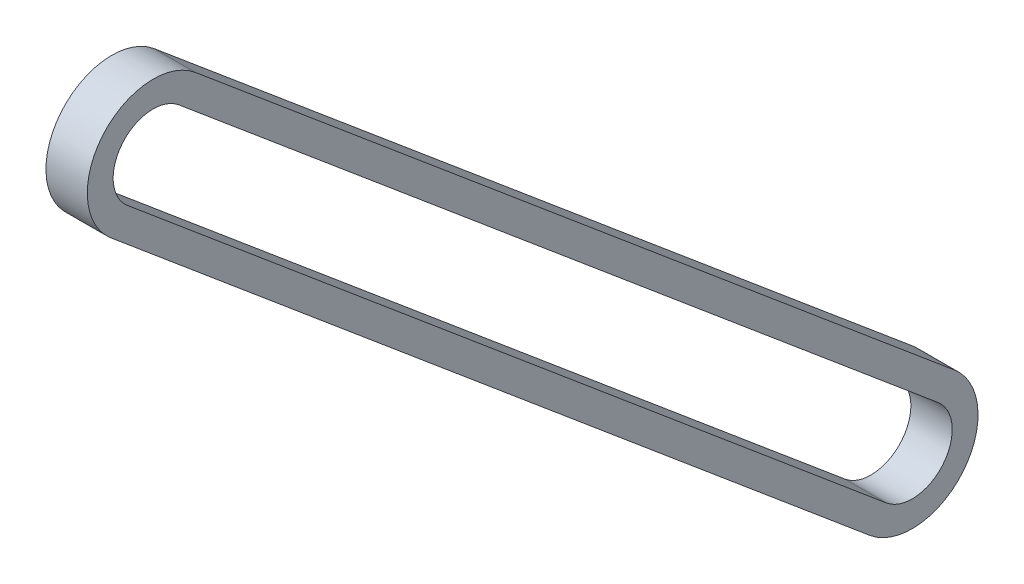
ISO-10303-21;
HEADER;
FILE_DESCRIPTION(('STEP AP214'),'2;1');
FILE_NAME('part.step','',(''),(''),'','','');
FILE_SCHEMA(('AUTOMOTIVE_DESIGN { 1 0 10303 214 1 1 1 1 }'));
ENDSEC;
DATA;
#1=APPLICATION_CONTEXT('core data for automotive mechanical design processes');
#2=APPLICATION_PROTOCOL_DEFINITION('international standard','automotive_design',2000,#1);
#3=PRODUCT_CONTEXT('',#1,'mechanical');
#4=PRODUCT('Part','Part','',(#3));
#5=PRODUCT_RELATED_PRODUCT_CATEGORY('part','',(#4));
#6=PRODUCT_DEFINITION_FORMATION('','',#4);
#7=PRODUCT_DEFINITION_CONTEXT('part definition',#1,'design');
#8=PRODUCT_DEFINITION('design','',#6,#7);
#9=PRODUCT_DEFINITION_SHAPE('','',#8);
#10=(LENGTH_UNIT() NAMED_UNIT(*) SI_UNIT(.MILLI.,.METRE.));
#11=(NAMED_UNIT(*) PLANE_ANGLE_UNIT() SI_UNIT($,.RADIAN.));
#12=(NAMED_UNIT(*) SI_UNIT($,.STERADIAN.) SOLID_ANGLE_UNIT());
#13=UNCERTAINTY_MEASURE_WITH_UNIT(LENGTH_MEASURE(1.E-05),#10,'distance_accuracy_value','');
#14=(GEOMETRIC_REPRESENTATION_CONTEXT(3) GLOBAL_UNCERTAINTY_ASSIGNED_CONTEXT((#13)) GLOBAL_UNIT_ASSIGNED_CONTEXT((#10,
#11,#12)) REPRESENTATION_CONTEXT('',''));
#15=CARTESIAN_POINT('',(0.,0.,0.));
#16=DIRECTION('',(0.,0.,1.));
#17=DIRECTION('',(1.,0.,0.));
#18=AXIS2_PLACEMENT_3D('',#15,#16,#17);
#19=CARTESIAN_POINT('',(3.58823967015649,-11.2727676890632,9.46346433075354));
#20=DIRECTION('',(8.28983744360699E-13,0.765894239141476,-0.642966573353467));
#21=DIRECTION('',(0.,0.642966573353467,0.765894239141476));
#22=AXIS2_PLACEMENT_3D('',#19,#20,#21);
#23=PLANE('',#22);
#24=DIRECTION('',(4.66761576994982E-13,0.642966573353467,0.765894239141476));
#25=VECTOR('',#24,1.);
#26=CARTESIAN_POINT('',(5.18823967015649,-11.2727676890647,9.46346433075382));
#27=LINE('',#26,#25);
#28=CARTESIAN_POINT('',(5.18823967013915,-35.1470704539788,-18.9753250386508));
#29=VERTEX_POINT('',#28);
#30=CARTESIAN_POINT('',(5.18823967015707,-10.4744035818647,10.414466289149));
#31=VERTEX_POINT('',#30);
#32=EDGE_CURVE('E146',#29,#31,#27,.T.);
#33=ORIENTED_EDGE('',*,*,#32,.T.);
#34=DIRECTION('',(1.,-9.3502330184165E-13,1.75522007977071E-13));
#35=VECTOR('',#34,1.);
#36=CARTESIAN_POINT('',(3.58823967015707,-10.4744035818633,10.4144662891487));
#37=LINE('',#36,#35);
#38=CARTESIAN_POINT('',(3.58823967015707,-10.4744035818633,10.4144662891487));
#39=VERTEX_POINT('',#38);
#40=EDGE_CURVE('E11',#39,#31,#37,.T.);
#41=ORIENTED_EDGE('',*,*,#40,.F.);
#42=DIRECTION('',(4.66761576994982E-13,0.642966573353467,0.765894239141476));
#43=VECTOR('',#42,1.);
#44=CARTESIAN_POINT('',(3.58823967015649,-11.2727676890632,9.46346433075354));
#45=LINE('',#44,#43);
#46=CARTESIAN_POINT('',(3.58823967013915,-35.1470704539773,-18.9753250386511));
#47=VERTEX_POINT('',#46);
#48=EDGE_CURVE('E122',#47,#39,#45,.T.);
#49=ORIENTED_EDGE('',*,*,#48,.F.);
#50=DIRECTION('',(1.,-9.3502330184165E-13,1.75522007977071E-13));
#51=VECTOR('',#50,1.);
#52=CARTESIAN_POINT('',(3.58823967013915,-35.1470704539773,-18.9753250386511));
#53=LINE('',#52,#51);
#54=EDGE_CURVE('E153',#47,#29,#53,.T.);
#55=ORIENTED_EDGE('',*,*,#54,.T.);
#56=EDGE_LOOP('',(#33,#41,#49,#55));
#57=FACE_BOUND('',#56,.T.);
#58=ADVANCED_FACE('F41',(#57),#23,.F.);
#59=CARTESIAN_POINT('',(3.58823967015918,-8.52137327205248,8.77490152709738));
#60=DIRECTION('',(1.,-9.3502330184165E-13,1.75522007977071E-13));
#61=DIRECTION('',(9.3502330184165E-13,1.,0.));
#62=AXIS2_PLACEMENT_3D('',#59,#60,#61);
#63=CYLINDRICAL_SURFACE('',#62,2.55000000000001);
#64=CARTESIAN_POINT('',(5.18823967015918,-8.52137327205398,8.77490152709766));
#65=DIRECTION('',(-1.,9.35018043853885E-13,-1.75512184079218E-13));
#66=DIRECTION('',(-9.35018043853885E-13,-1.,0.));
#67=AXIS2_PLACEMENT_3D('',#64,#65,#66);
#68=CIRCLE('',#67,2.55000000000001);
#69=CARTESIAN_POINT('',(5.18823967016129,-6.56834296224321,7.13533676504631));
#70=VERTEX_POINT('',#69);
#71=EDGE_CURVE('E127',#31,#70,#68,.T.);
#72=ORIENTED_EDGE('',*,*,#71,.T.);
#73=DIRECTION('',(1.,-9.3502330184165E-13,1.75522007977071E-13));
#74=VECTOR('',#73,1.);
#75=CARTESIAN_POINT('',(3.58823967016129,-6.56834296224171,7.13533676504603));
#76=LINE('',#75,#74);
#77=CARTESIAN_POINT('',(3.58823967016129,-6.56834296224171,7.13533676504603));
#78=VERTEX_POINT('',#77);
#79=EDGE_CURVE('E51',#78,#70,#76,.T.);
#80=ORIENTED_EDGE('',*,*,#79,.F.);
#81=CARTESIAN_POINT('',(3.58823967015918,-8.52137327205248,8.77490152709738));
#82=DIRECTION('',(-1.,9.35018043853885E-13,-1.75512184079218E-13));
#83=DIRECTION('',(-9.35018043853885E-13,-1.,0.));
#84=AXIS2_PLACEMENT_3D('',#81,#82,#83);
#85=CIRCLE('',#84,2.55000000000001);
#86=EDGE_CURVE('E116',#39,#78,#85,.T.);
#87=ORIENTED_EDGE('',*,*,#86,.F.);
#88=ORIENTED_EDGE('',*,*,#40,.T.);
#89=EDGE_LOOP('',(#72,#80,#87,#88));
#90=FACE_BOUND('',#89,.T.);
#91=ADVANCED_FACE('F126',(#90),#63,.T.);
#92=CARTESIAN_POINT('',(3.58823967016071,-7.36670706944168,6.18433480665086));
#93=DIRECTION('',(-8.28983744360698E-13,-0.765894239141476,0.642966573353467));
#94=DIRECTION('',(0.,-0.642966573353467,-0.765894239141476));
#95=AXIS2_PLACEMENT_3D('',#92,#93,#94);
#96=PLANE('',#95);
#97=DIRECTION('',(-4.66761576994983E-13,-0.642966573353467,-0.765894239141476));
#98=VECTOR('',#97,1.);
#99=CARTESIAN_POINT('',(5.18823967016071,-7.36670706944318,6.18433480665114));
#100=LINE('',#99,#98);
#101=CARTESIAN_POINT('',(5.18823967014338,-31.2410098343573,-22.2544545627535));
#102=VERTEX_POINT('',#101);
#103=EDGE_CURVE('E89',#70,#102,#100,.T.);
#104=ORIENTED_EDGE('',*,*,#103,.T.);
#105=DIRECTION('',(1.,-9.3502330184165E-13,1.75522007977071E-13));
#106=VECTOR('',#105,1.);
#107=CARTESIAN_POINT('',(3.58823967014338,-31.2410098343558,-22.2544545627538));
#108=LINE('',#107,#106);
#109=CARTESIAN_POINT('',(3.58823967014338,-31.2410098343558,-22.2544545627538));
#110=VERTEX_POINT('',#109);
#111=EDGE_CURVE('E128',#110,#102,#108,.T.);
#112=ORIENTED_EDGE('',*,*,#111,.F.);
#113=DIRECTION('',(-4.66761576994983E-13,-0.642966573353467,-0.765894239141476));
#114=VECTOR('',#113,1.);
#115=CARTESIAN_POINT('',(3.58823967016071,-7.36670706944168,6.18433480665086));
#116=LINE('',#115,#114);
#117=EDGE_CURVE('E120',#78,#110,#116,.T.);
#118=ORIENTED_EDGE('',*,*,#117,.F.);
#119=ORIENTED_EDGE('',*,*,#79,.T.);
#120=EDGE_LOOP('',(#104,#112,#118,#119));
#121=FACE_BOUND('',#120,.T.);
#122=ADVANCED_FACE('F130',(#121),#96,.F.);
#123=CARTESIAN_POINT('',(3.58823967014127,-33.1940401441665,-20.6148898007025));
#124=DIRECTION('',(1.,-9.3502330184165E-13,1.75522007977071E-13));
#125=DIRECTION('',(9.3502330184165E-13,1.,0.));
#126=AXIS2_PLACEMENT_3D('',#123,#124,#125);
#127=CYLINDRICAL_SURFACE('',#126,1.55000000000567);
#128=CARTESIAN_POINT('',(5.18823967014127,-33.194040144168,-20.6148898007022));
#129=DIRECTION('',(-1.,9.35018043853885E-13,-1.75512184079218E-13));
#130=DIRECTION('',(-9.35018043853885E-13,-1.,0.));
#131=AXIS2_PLACEMENT_3D('',#128,#129,#130);
#132=CIRCLE('',#131,1.55000000000567);
#133=CARTESIAN_POINT('',(5.18823967014255,-32.0069040734988,-21.6114879894001));
#134=VERTEX_POINT('',#133);
#135=CARTESIAN_POINT('',(5.18823967013998,-34.3811762148373,-19.6182916120043));
#136=VERTEX_POINT('',#135);
#137=EDGE_CURVE('E136',#134,#136,#132,.T.);
#138=ORIENTED_EDGE('',*,*,#137,.F.);
#139=DIRECTION('',(1.,-9.3502330184165E-13,1.75522007977071E-13));
#140=VECTOR('',#139,1.);
#141=CARTESIAN_POINT('',(3.58823967014255,-32.0069040734973,-21.6114879894003));
#142=LINE('',#141,#140);
#143=CARTESIAN_POINT('',(3.58823967014255,-32.0069040734973,-21.6114879894003));
#144=VERTEX_POINT('',#143);
#145=EDGE_CURVE('E45',#144,#134,#142,.T.);
#146=ORIENTED_EDGE('',*,*,#145,.F.);
#147=CARTESIAN_POINT('',(3.58823967014127,-33.1940401441665,-20.6148898007025));
#148=DIRECTION('',(-1.,9.35018043853885E-13,-1.75512184079218E-13));
#149=DIRECTION('',(-9.35018043853885E-13,-1.,0.));
#150=AXIS2_PLACEMENT_3D('',#147,#148,#149);
#151=CIRCLE('',#150,1.55000000000567);
#152=CARTESIAN_POINT('',(3.58823967013998,-34.3811762148358,-19.6182916120046));
#153=VERTEX_POINT('',#152);
#154=EDGE_CURVE('E152',#144,#153,#151,.T.);
#155=ORIENTED_EDGE('',*,*,#154,.T.);
#156=DIRECTION('',(1.,-9.3502330184165E-13,1.75522007977071E-13));
#157=VECTOR('',#156,1.);
#158=CARTESIAN_POINT('',(3.58823967013998,-34.3811762148358,-19.6182916120046));
#159=LINE('',#158,#157);
#160=EDGE_CURVE('E132',#153,#136,#159,.T.);
#161=ORIENTED_EDGE('',*,*,#160,.T.);
#162=EDGE_LOOP('',(#138,#146,#155,#161));
#163=FACE_BOUND('',#162,.T.);
#164=ADVANCED_FACE('F43',(#163),#127,.F.);
#165=CARTESIAN_POINT('',(3.58823967015989,-8.13260130858316,6.82730138000433));
#166=DIRECTION('',(8.28983744360698E-13,0.765894239141476,-0.642966573353467));
#167=DIRECTION('',(0.,0.642966573353467,0.765894239141476));
#168=AXIS2_PLACEMENT_3D('',#165,#166,#167);
#169=PLANE('',#168);
#170=DIRECTION('',(4.66761576994983E-13,0.642966573353467,0.765894239141476));
#171=VECTOR('',#170,1.);
#172=CARTESIAN_POINT('',(5.18823967015989,-8.13260130858466,6.82730138000461));
#173=LINE('',#172,#171);
#174=CARTESIAN_POINT('',(5.18823967016046,-7.33423720138469,7.77830333839978));
#175=VERTEX_POINT('',#174);
#176=EDGE_CURVE('E139',#134,#175,#173,.T.);
#177=ORIENTED_EDGE('',*,*,#176,.T.);
#178=DIRECTION('',(1.,-9.3502330184165E-13,1.75522007977071E-13));
#179=VECTOR('',#178,1.);
#180=CARTESIAN_POINT('',(3.58823967016046,-7.33423720138319,7.7783033383995));
#181=LINE('',#180,#179);
#182=CARTESIAN_POINT('',(3.58823967016046,-7.33423720138319,7.7783033383995));
#183=VERTEX_POINT('',#182);
#184=EDGE_CURVE('E159',#183,#175,#181,.T.);
#185=ORIENTED_EDGE('',*,*,#184,.F.);
#186=DIRECTION('',(4.66761576994983E-13,0.642966573353467,0.765894239141476));
#187=VECTOR('',#186,1.);
#188=CARTESIAN_POINT('',(3.58823967015989,-8.13260130858316,6.82730138000433));
#189=LINE('',#188,#187);
#190=EDGE_CURVE('E168',#144,#183,#189,.T.);
#191=ORIENTED_EDGE('',*,*,#190,.F.);
#192=ORIENTED_EDGE('',*,*,#145,.T.);
#193=EDGE_LOOP('',(#177,#185,#191,#192));
#194=FACE_BOUND('',#193,.T.);
#195=ADVANCED_FACE('F167',(#194),#169,.F.);
#196=CARTESIAN_POINT('',(3.58823967015918,-8.52137327205248,8.77490152709738));
#197=DIRECTION('',(1.,-9.3502330184165E-13,1.75522007977071E-13));
#198=DIRECTION('',(9.3502330184165E-13,1.,0.));
#199=AXIS2_PLACEMENT_3D('',#196,#197,#198);
#200=CYLINDRICAL_SURFACE('',#199,1.55);
#201=CARTESIAN_POINT('',(5.18823967015918,-8.52137327205398,8.77490152709766));
#202=DIRECTION('',(-1.,9.35018043853885E-13,-1.75512184079218E-13));
#203=DIRECTION('',(-9.35018043853885E-13,-1.,0.));
#204=AXIS2_PLACEMENT_3D('',#201,#202,#203);
#205=CIRCLE('',#204,1.55);
#206=CARTESIAN_POINT('',(5.18823967015789,-9.70850934272326,9.77149971579553));
#207=VERTEX_POINT('',#206);
#208=EDGE_CURVE('E141',#175,#207,#205,.F.);
#209=ORIENTED_EDGE('',*,*,#208,.T.);
#210=DIRECTION('',(1.,-9.3502330184165E-13,1.75522007977071E-13));
#211=VECTOR('',#210,1.);
#212=CARTESIAN_POINT('',(3.58823967015789,-9.70850934272177,9.77149971579525));
#213=LINE('',#212,#211);
#214=CARTESIAN_POINT('',(3.58823967015789,-9.70850934272177,9.77149971579525));
#215=VERTEX_POINT('',#214);
#216=EDGE_CURVE('E157',#215,#207,#213,.T.);
#217=ORIENTED_EDGE('',*,*,#216,.F.);
#218=CARTESIAN_POINT('',(3.58823967015918,-8.52137327205248,8.77490152709738));
#219=DIRECTION('',(-1.,9.35018043853885E-13,-1.75512184079218E-13));
#220=DIRECTION('',(-9.35018043853885E-13,-1.,0.));
#221=AXIS2_PLACEMENT_3D('',#218,#219,#220);
#222=CIRCLE('',#221,1.55);
#223=EDGE_CURVE('E181',#183,#215,#222,.F.);
#224=ORIENTED_EDGE('',*,*,#223,.F.);
#225=ORIENTED_EDGE('',*,*,#184,.T.);
#226=EDGE_LOOP('',(#209,#217,#224,#225));
#227=FACE_BOUND('',#226,.T.);
#228=ADVANCED_FACE('F180',(#227),#200,.F.);
#229=CARTESIAN_POINT('',(3.58823967015732,-10.5068734499217,8.82049775740007));
#230=DIRECTION('',(-8.28983744360698E-13,-0.765894239141476,0.642966573353467));
#231=DIRECTION('',(0.,-0.642966573353467,-0.765894239141476));
#232=AXIS2_PLACEMENT_3D('',#229,#230,#231);
#233=PLANE('',#232);
#234=DIRECTION('',(-4.66761576994983E-13,-0.642966573353467,-0.765894239141476));
#235=VECTOR('',#234,1.);
#236=CARTESIAN_POINT('',(5.18823967015731,-10.5068734499232,8.82049775740035));
#237=LINE('',#236,#235);
#238=EDGE_CURVE('E143',#207,#136,#237,.T.);
#239=ORIENTED_EDGE('',*,*,#238,.T.);
#240=ORIENTED_EDGE('',*,*,#160,.F.);
#241=DIRECTION('',(-4.66761576994983E-13,-0.642966573353467,-0.765894239141476));
#242=VECTOR('',#241,1.);
#243=CARTESIAN_POINT('',(3.58823967015732,-10.5068734499217,8.82049775740007));
#244=LINE('',#243,#242);
#245=EDGE_CURVE('E179',#215,#153,#244,.T.);
#246=ORIENTED_EDGE('',*,*,#245,.F.);
#247=ORIENTED_EDGE('',*,*,#216,.T.);
#248=EDGE_LOOP('',(#239,#240,#246,#247));
#249=FACE_BOUND('',#248,.T.);
#250=ADVANCED_FACE('F177',(#249),#233,.F.);
#251=CARTESIAN_POINT('',(3.58823967014127,-33.1940401441665,-20.6148898007025));
#252=DIRECTION('',(1.,-9.3502330184165E-13,1.75522007977071E-13));
#253=DIRECTION('',(9.3502330184165E-13,1.,0.));
#254=AXIS2_PLACEMENT_3D('',#251,#252,#253);
#255=CYLINDRICAL_SURFACE('',#254,2.55);
#256=CARTESIAN_POINT('',(5.18823967014127,-33.194040144168,-20.6148898007022));
#257=DIRECTION('',(-1.,9.35018043853885E-13,-1.75512184079218E-13));
#258=DIRECTION('',(-9.35018043853885E-13,-1.,0.));
#259=AXIS2_PLACEMENT_3D('',#256,#257,#258);
#260=CIRCLE('',#259,2.55);
#261=EDGE_CURVE('E95',#102,#29,#260,.T.);
#262=ORIENTED_EDGE('',*,*,#261,.T.);
#263=ORIENTED_EDGE('',*,*,#54,.F.);
#264=CARTESIAN_POINT('',(3.58823967014127,-33.1940401441665,-20.6148898007025));
#265=DIRECTION('',(-1.,9.35018043853885E-13,-1.75512184079218E-13));
#266=DIRECTION('',(-9.35018043853885E-13,-1.,0.));
#267=AXIS2_PLACEMENT_3D('',#264,#265,#266);
#268=CIRCLE('',#267,2.55);
#269=EDGE_CURVE('E60',#110,#47,#268,.T.);
#270=ORIENTED_EDGE('',*,*,#269,.F.);
#271=ORIENTED_EDGE('',*,*,#111,.T.);
#272=EDGE_LOOP('',(#262,#263,#270,#271));
#273=FACE_BOUND('',#272,.T.);
#274=ADVANCED_FACE('F188',(#273),#255,.T.);
#275=CARTESIAN_POINT('',(3.58823967016869,-3.35506042449961E-12,6.29764063274434E-13));
#276=DIRECTION('',(-1.,9.35018043853885E-13,-1.75512184079218E-13));
#277=DIRECTION('',(-9.35018043853885E-13,-1.,0.));
#278=AXIS2_PLACEMENT_3D('',#275,#276,#277);
#279=PLANE('',#278);
#280=ORIENTED_EDGE('',*,*,#154,.F.);
#281=ORIENTED_EDGE('',*,*,#190,.T.);
#282=ORIENTED_EDGE('',*,*,#223,.T.);
#283=ORIENTED_EDGE('',*,*,#245,.T.);
#284=EDGE_LOOP('',(#280,#281,#282,#283));
#285=FACE_BOUND('',#284,.T.);
#286=ORIENTED_EDGE('',*,*,#48,.T.);
#287=ORIENTED_EDGE('',*,*,#86,.T.);
#288=ORIENTED_EDGE('',*,*,#117,.T.);
#289=ORIENTED_EDGE('',*,*,#269,.T.);
#290=EDGE_LOOP('',(#286,#287,#288,#289));
#291=FACE_BOUND('',#290,.T.);
#292=ADVANCED_FACE('F118',(#285,#291),#279,.T.);
#293=CARTESIAN_POINT('',(5.18823967016869,-4.85109770744625E-12,9.10599276037748E-13));
#294=DIRECTION('',(-1.,9.35018043853885E-13,-1.75512184079218E-13));
#295=DIRECTION('',(-9.35018043853885E-13,-1.,0.));
#296=AXIS2_PLACEMENT_3D('',#293,#294,#295);
#297=PLANE('',#296);
#298=ORIENTED_EDGE('',*,*,#137,.T.);
#299=ORIENTED_EDGE('',*,*,#238,.F.);
#300=ORIENTED_EDGE('',*,*,#208,.F.);
#301=ORIENTED_EDGE('',*,*,#176,.F.);
#302=EDGE_LOOP('',(#298,#299,#300,#301));
#303=FACE_BOUND('',#302,.T.);
#304=ORIENTED_EDGE('',*,*,#32,.F.);
#305=ORIENTED_EDGE('',*,*,#261,.F.);
#306=ORIENTED_EDGE('',*,*,#103,.F.);
#307=ORIENTED_EDGE('',*,*,#71,.F.);
#308=EDGE_LOOP('',(#304,#305,#306,#307));
#309=FACE_BOUND('',#308,.T.);
#310=ADVANCED_FACE('F171',(#303,#309),#297,.F.);
#311=CLOSED_SHELL('',(#58,#91,#122,#164,#195,#228,#250,#274,#292,#310));
#312=MANIFOLD_SOLID_BREP('B2',#311);
#313=ADVANCED_BREP_SHAPE_REPRESENTATION('',(#18,#312),#14);
#314=SHAPE_DEFINITION_REPRESENTATION(#9,#313);
ENDSEC;
END-ISO-10303-21;
